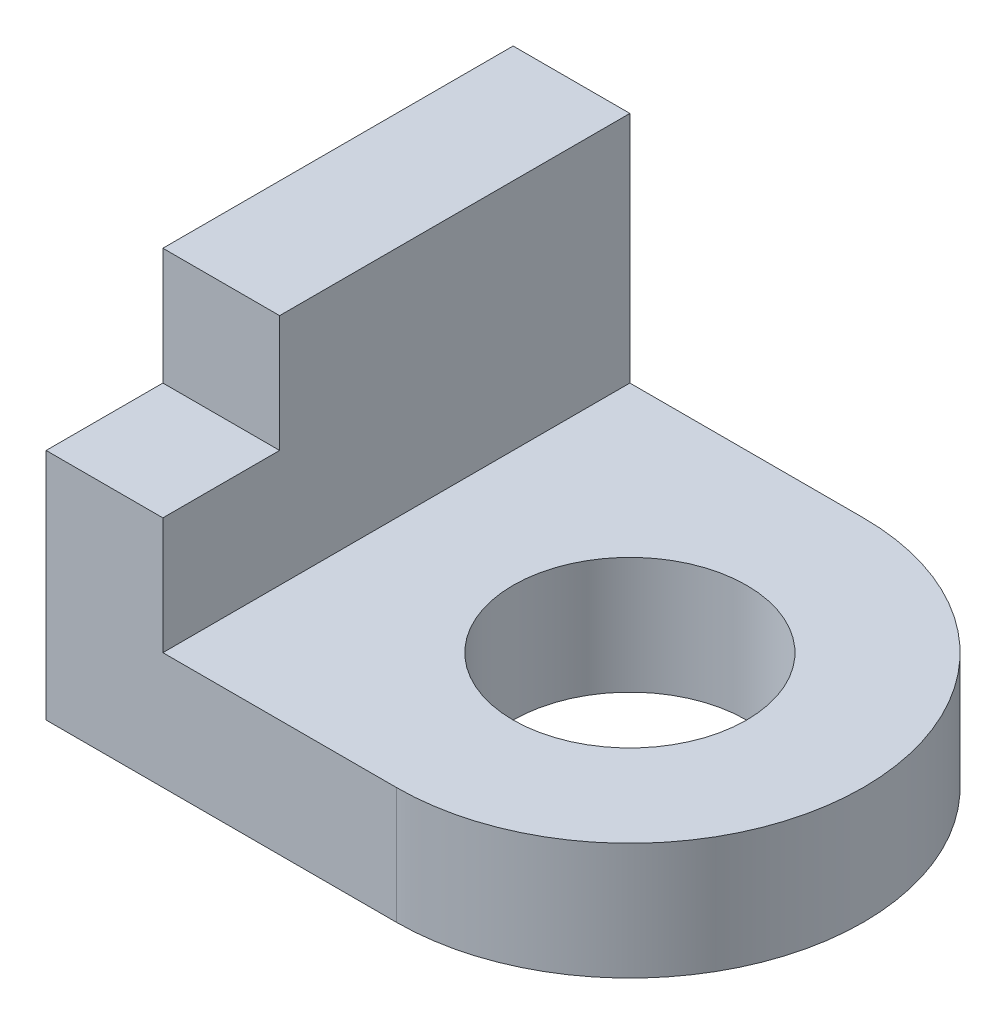
ISO-10303-21;
HEADER;
FILE_DESCRIPTION(('STEP AP214'),'2;1');
FILE_NAME('part.step','',(''),(''),'','','');
FILE_SCHEMA(('AUTOMOTIVE_DESIGN { 1 0 10303 214 1 1 1 1 }'));
ENDSEC;
DATA;
#1=APPLICATION_CONTEXT('core data for automotive mechanical design processes');
#2=APPLICATION_PROTOCOL_DEFINITION('international standard','automotive_design',2000,#1);
#3=PRODUCT_CONTEXT('',#1,'mechanical');
#4=PRODUCT('Part','Part','',(#3));
#5=PRODUCT_RELATED_PRODUCT_CATEGORY('part','',(#4));
#6=PRODUCT_DEFINITION_FORMATION('','',#4);
#7=PRODUCT_DEFINITION_CONTEXT('part definition',#1,'design');
#8=PRODUCT_DEFINITION('design','',#6,#7);
#9=PRODUCT_DEFINITION_SHAPE('','',#8);
#10=(LENGTH_UNIT() NAMED_UNIT(*) SI_UNIT(.MILLI.,.METRE.));
#11=(NAMED_UNIT(*) PLANE_ANGLE_UNIT() SI_UNIT($,.RADIAN.));
#12=(NAMED_UNIT(*) SI_UNIT($,.STERADIAN.) SOLID_ANGLE_UNIT());
#13=UNCERTAINTY_MEASURE_WITH_UNIT(LENGTH_MEASURE(1.E-05),#10,'distance_accuracy_value','');
#14=(GEOMETRIC_REPRESENTATION_CONTEXT(3) GLOBAL_UNCERTAINTY_ASSIGNED_CONTEXT((#13)) GLOBAL_UNIT_ASSIGNED_CONTEXT((#10,
#11,#12)) REPRESENTATION_CONTEXT('',''));
#15=CARTESIAN_POINT('',(0.,0.,0.));
#16=DIRECTION('',(0.,0.,1.));
#17=DIRECTION('',(1.,0.,0.));
#18=AXIS2_PLACEMENT_3D('',#15,#16,#17);
#19=CARTESIAN_POINT('',(0.,10.,0.));
#20=DIRECTION('',(0.,1.,0.));
#21=DIRECTION('',(0.,0.,1.));
#22=AXIS2_PLACEMENT_3D('',#19,#20,#21);
#23=PLANE('',#22);
#24=DIRECTION('',(0.,0.,-1.));
#25=VECTOR('',#24,1.);
#26=CARTESIAN_POINT('',(-20.,10.,20.));
#27=LINE('',#26,#25);
#28=CARTESIAN_POINT('',(-20.,10.,20.));
#29=VERTEX_POINT('',#28);
#30=CARTESIAN_POINT('',(-20.,10.,-20.));
#31=VERTEX_POINT('',#30);
#32=EDGE_CURVE('E51',#29,#31,#27,.T.);
#33=ORIENTED_EDGE('',*,*,#32,.F.);
#34=DIRECTION('',(1.,0.,0.));
#35=VECTOR('',#34,1.);
#36=CARTESIAN_POINT('',(-30.,10.,20.));
#37=LINE('',#36,#35);
#38=CARTESIAN_POINT('',(0.,10.,20.));
#39=VERTEX_POINT('',#38);
#40=EDGE_CURVE('E56',#29,#39,#37,.T.);
#41=ORIENTED_EDGE('',*,*,#40,.T.);
#42=CARTESIAN_POINT('',(0.,10.,0.));
#43=DIRECTION('',(0.,1.,0.));
#44=DIRECTION('',(0.,0.,1.));
#45=AXIS2_PLACEMENT_3D('',#42,#43,#44);
#46=CIRCLE('',#45,20.);
#47=CARTESIAN_POINT('',(0.,10.,-20.));
#48=VERTEX_POINT('',#47);
#49=EDGE_CURVE('E87',#39,#48,#46,.T.);
#50=ORIENTED_EDGE('',*,*,#49,.T.);
#51=DIRECTION('',(-1.,0.,0.));
#52=VECTOR('',#51,1.);
#53=CARTESIAN_POINT('',(0.,10.,-20.));
#54=LINE('',#53,#52);
#55=EDGE_CURVE('E144',#48,#31,#54,.T.);
#56=ORIENTED_EDGE('',*,*,#55,.T.);
#57=EDGE_LOOP('',(#33,#41,#50,#56));
#58=FACE_BOUND('',#57,.T.);
#59=CARTESIAN_POINT('',(0.,10.,0.));
#60=DIRECTION('',(0.,1.,0.));
#61=DIRECTION('',(0.,0.,1.));
#62=AXIS2_PLACEMENT_3D('',#59,#60,#61);
#63=CIRCLE('',#62,10.);
#64=CARTESIAN_POINT('',(0.,10.,10.));
#65=VERTEX_POINT('',#64);
#66=EDGE_CURVE('E98',#65,#65,#63,.T.);
#67=ORIENTED_EDGE('',*,*,#66,.F.);
#68=EDGE_LOOP('',(#67));
#69=FACE_BOUND('',#68,.T.);
#70=ADVANCED_FACE('F36',(#58,#69),#23,.T.);
#71=CARTESIAN_POINT('',(0.,0.,0.));
#72=DIRECTION('',(0.,1.,0.));
#73=DIRECTION('',(0.,0.,1.));
#74=AXIS2_PLACEMENT_3D('',#71,#72,#73);
#75=PLANE('',#74);
#76=CARTESIAN_POINT('',(0.,0.,0.));
#77=DIRECTION('',(0.,1.,0.));
#78=DIRECTION('',(0.,0.,1.));
#79=AXIS2_PLACEMENT_3D('',#76,#77,#78);
#80=CIRCLE('',#79,20.);
#81=CARTESIAN_POINT('',(0.,0.,20.));
#82=VERTEX_POINT('',#81);
#83=CARTESIAN_POINT('',(0.,0.,-20.));
#84=VERTEX_POINT('',#83);
#85=EDGE_CURVE('E93',#82,#84,#80,.T.);
#86=ORIENTED_EDGE('',*,*,#85,.F.);
#87=DIRECTION('',(1.,0.,0.));
#88=VECTOR('',#87,1.);
#89=CARTESIAN_POINT('',(-30.,0.,20.));
#90=LINE('',#89,#88);
#91=CARTESIAN_POINT('',(-30.,0.,20.));
#92=VERTEX_POINT('',#91);
#93=EDGE_CURVE('E76',#92,#82,#90,.T.);
#94=ORIENTED_EDGE('',*,*,#93,.F.);
#95=DIRECTION('',(0.,0.,1.));
#96=VECTOR('',#95,1.);
#97=CARTESIAN_POINT('',(-30.,0.,-20.));
#98=LINE('',#97,#96);
#99=CARTESIAN_POINT('',(-30.,0.,-20.));
#100=VERTEX_POINT('',#99);
#101=EDGE_CURVE('E88',#100,#92,#98,.T.);
#102=ORIENTED_EDGE('',*,*,#101,.F.);
#103=DIRECTION('',(-1.,0.,0.));
#104=VECTOR('',#103,1.);
#105=CARTESIAN_POINT('',(0.,0.,-20.));
#106=LINE('',#105,#104);
#107=EDGE_CURVE('E97',#84,#100,#106,.T.);
#108=ORIENTED_EDGE('',*,*,#107,.F.);
#109=EDGE_LOOP('',(#86,#94,#102,#108));
#110=FACE_BOUND('',#109,.T.);
#111=CARTESIAN_POINT('',(0.,0.,0.));
#112=DIRECTION('',(0.,1.,0.));
#113=DIRECTION('',(0.,0.,1.));
#114=AXIS2_PLACEMENT_3D('',#111,#112,#113);
#115=CIRCLE('',#114,10.);
#116=CARTESIAN_POINT('',(0.,0.,10.));
#117=VERTEX_POINT('',#116);
#118=EDGE_CURVE('E102',#117,#117,#115,.T.);
#119=ORIENTED_EDGE('',*,*,#118,.T.);
#120=EDGE_LOOP('',(#119));
#121=FACE_BOUND('',#120,.T.);
#122=ADVANCED_FACE('F95',(#110,#121),#75,.F.);
#123=CARTESIAN_POINT('',(0.,10.,0.));
#124=DIRECTION('',(0.,-1.,0.));
#125=DIRECTION('',(0.,0.,-1.));
#126=AXIS2_PLACEMENT_3D('',#123,#124,#125);
#127=CYLINDRICAL_SURFACE('',#126,20.);
#128=ORIENTED_EDGE('',*,*,#85,.T.);
#129=DIRECTION('',(0.,-1.,0.));
#130=VECTOR('',#129,1.);
#131=CARTESIAN_POINT('',(0.,10.,-20.));
#132=LINE('',#131,#130);
#133=EDGE_CURVE('E11',#48,#84,#132,.T.);
#134=ORIENTED_EDGE('',*,*,#133,.F.);
#135=ORIENTED_EDGE('',*,*,#49,.F.);
#136=DIRECTION('',(0.,-1.,0.));
#137=VECTOR('',#136,1.);
#138=CARTESIAN_POINT('',(0.,10.,20.));
#139=LINE('',#138,#137);
#140=EDGE_CURVE('E79',#39,#82,#139,.T.);
#141=ORIENTED_EDGE('',*,*,#140,.T.);
#142=EDGE_LOOP('',(#128,#134,#135,#141));
#143=FACE_BOUND('',#142,.T.);
#144=ADVANCED_FACE('F38',(#143),#127,.T.);
#145=CARTESIAN_POINT('',(0.,10.,-20.));
#146=DIRECTION('',(0.,0.,1.));
#147=DIRECTION('',(1.,0.,0.));
#148=AXIS2_PLACEMENT_3D('',#145,#146,#147);
#149=PLANE('',#148);
#150=ORIENTED_EDGE('',*,*,#107,.T.);
#151=DIRECTION('',(0.,-1.,0.));
#152=VECTOR('',#151,1.);
#153=CARTESIAN_POINT('',(-30.,10.,-20.));
#154=LINE('',#153,#152);
#155=CARTESIAN_POINT('',(-30.,30.,-20.));
#156=VERTEX_POINT('',#155);
#157=EDGE_CURVE('E44',#156,#100,#154,.T.);
#158=ORIENTED_EDGE('',*,*,#157,.F.);
#159=DIRECTION('',(-1.,0.,0.));
#160=VECTOR('',#159,1.);
#161=CARTESIAN_POINT('',(-20.,30.,-20.));
#162=LINE('',#161,#160);
#163=CARTESIAN_POINT('',(-20.,30.,-20.));
#164=VERTEX_POINT('',#163);
#165=EDGE_CURVE('E123',#164,#156,#162,.T.);
#166=ORIENTED_EDGE('',*,*,#165,.F.);
#167=DIRECTION('',(0.,1.,0.));
#168=VECTOR('',#167,1.);
#169=CARTESIAN_POINT('',(-20.,10.,-20.));
#170=LINE('',#169,#168);
#171=EDGE_CURVE('E154',#31,#164,#170,.T.);
#172=ORIENTED_EDGE('',*,*,#171,.F.);
#173=ORIENTED_EDGE('',*,*,#55,.F.);
#174=ORIENTED_EDGE('',*,*,#133,.T.);
#175=EDGE_LOOP('',(#150,#158,#166,#172,#173,#174));
#176=FACE_BOUND('',#175,.T.);
#177=ADVANCED_FACE('F120',(#176),#149,.F.);
#178=CARTESIAN_POINT('',(-30.,10.,-20.));
#179=DIRECTION('',(1.,0.,0.));
#180=DIRECTION('',(0.,0.,-1.));
#181=AXIS2_PLACEMENT_3D('',#178,#179,#180);
#182=PLANE('',#181);
#183=ORIENTED_EDGE('',*,*,#101,.T.);
#184=DIRECTION('',(0.,-1.,0.));
#185=VECTOR('',#184,1.);
#186=CARTESIAN_POINT('',(-30.,10.,20.));
#187=LINE('',#186,#185);
#188=CARTESIAN_POINT('',(-30.,20.,20.));
#189=VERTEX_POINT('',#188);
#190=EDGE_CURVE('E83',#189,#92,#187,.T.);
#191=ORIENTED_EDGE('',*,*,#190,.F.);
#192=DIRECTION('',(0.,0.,1.));
#193=VECTOR('',#192,1.);
#194=CARTESIAN_POINT('',(-30.,20.,10.));
#195=LINE('',#194,#193);
#196=CARTESIAN_POINT('',(-30.,20.,10.));
#197=VERTEX_POINT('',#196);
#198=EDGE_CURVE('E165',#197,#189,#195,.T.);
#199=ORIENTED_EDGE('',*,*,#198,.F.);
#200=DIRECTION('',(0.,-1.,0.));
#201=VECTOR('',#200,1.);
#202=CARTESIAN_POINT('',(-30.,30.,9.99999999999999));
#203=LINE('',#202,#201);
#204=CARTESIAN_POINT('',(-30.,30.,9.99999999999999));
#205=VERTEX_POINT('',#204);
#206=EDGE_CURVE('E169',#205,#197,#203,.T.);
#207=ORIENTED_EDGE('',*,*,#206,.F.);
#208=DIRECTION('',(0.,0.,1.));
#209=VECTOR('',#208,1.);
#210=CARTESIAN_POINT('',(-30.,30.,-20.));
#211=LINE('',#210,#209);
#212=EDGE_CURVE('E116',#156,#205,#211,.T.);
#213=ORIENTED_EDGE('',*,*,#212,.F.);
#214=ORIENTED_EDGE('',*,*,#157,.T.);
#215=EDGE_LOOP('',(#183,#191,#199,#207,#213,#214));
#216=FACE_BOUND('',#215,.T.);
#217=ADVANCED_FACE('F112',(#216),#182,.F.);
#218=CARTESIAN_POINT('',(-30.,10.,20.));
#219=DIRECTION('',(0.,0.,-1.));
#220=DIRECTION('',(-1.,0.,0.));
#221=AXIS2_PLACEMENT_3D('',#218,#219,#220);
#222=PLANE('',#221);
#223=ORIENTED_EDGE('',*,*,#93,.T.);
#224=ORIENTED_EDGE('',*,*,#140,.F.);
#225=ORIENTED_EDGE('',*,*,#40,.F.);
#226=DIRECTION('',(0.,-1.,0.));
#227=VECTOR('',#226,1.);
#228=CARTESIAN_POINT('',(-20.,20.,20.));
#229=LINE('',#228,#227);
#230=CARTESIAN_POINT('',(-20.,20.,20.));
#231=VERTEX_POINT('',#230);
#232=EDGE_CURVE('E156',#231,#29,#229,.T.);
#233=ORIENTED_EDGE('',*,*,#232,.F.);
#234=DIRECTION('',(-1.,0.,0.));
#235=VECTOR('',#234,1.);
#236=CARTESIAN_POINT('',(-20.,20.,20.));
#237=LINE('',#236,#235);
#238=EDGE_CURVE('E134',#231,#189,#237,.T.);
#239=ORIENTED_EDGE('',*,*,#238,.T.);
#240=ORIENTED_EDGE('',*,*,#190,.T.);
#241=EDGE_LOOP('',(#223,#224,#225,#233,#239,#240));
#242=FACE_BOUND('',#241,.T.);
#243=ADVANCED_FACE('F78',(#242),#222,.F.);
#244=CARTESIAN_POINT('',(0.,10.,0.));
#245=DIRECTION('',(0.,-1.,0.));
#246=DIRECTION('',(0.,0.,-1.));
#247=AXIS2_PLACEMENT_3D('',#244,#245,#246);
#248=CYLINDRICAL_SURFACE('',#247,10.);
#249=ORIENTED_EDGE('',*,*,#66,.T.);
#250=EDGE_LOOP('',(#249));
#251=FACE_BOUND('',#250,.T.);
#252=ORIENTED_EDGE('',*,*,#118,.F.);
#253=EDGE_LOOP('',(#252));
#254=FACE_BOUND('',#253,.T.);
#255=ADVANCED_FACE('F205',(#251,#254),#248,.F.);
#256=CARTESIAN_POINT('',(-20.,20.,10.));
#257=DIRECTION('',(0.,-1.,0.));
#258=DIRECTION('',(0.,0.,-1.));
#259=AXIS2_PLACEMENT_3D('',#256,#257,#258);
#260=PLANE('',#259);
#261=ORIENTED_EDGE('',*,*,#198,.T.);
#262=ORIENTED_EDGE('',*,*,#238,.F.);
#263=DIRECTION('',(0.,0.,1.));
#264=VECTOR('',#263,1.);
#265=CARTESIAN_POINT('',(-20.,20.,10.));
#266=LINE('',#265,#264);
#267=CARTESIAN_POINT('',(-20.,20.,10.));
#268=VERTEX_POINT('',#267);
#269=EDGE_CURVE('E171',#268,#231,#266,.T.);
#270=ORIENTED_EDGE('',*,*,#269,.F.);
#271=DIRECTION('',(-1.,0.,0.));
#272=VECTOR('',#271,1.);
#273=CARTESIAN_POINT('',(-20.,20.,10.));
#274=LINE('',#273,#272);
#275=EDGE_CURVE('E138',#268,#197,#274,.T.);
#276=ORIENTED_EDGE('',*,*,#275,.T.);
#277=EDGE_LOOP('',(#261,#262,#270,#276));
#278=FACE_BOUND('',#277,.T.);
#279=ADVANCED_FACE('F178',(#278),#260,.F.);
#280=CARTESIAN_POINT('',(-20.,30.,-20.));
#281=DIRECTION('',(0.,-1.,0.));
#282=DIRECTION('',(0.,0.,-1.));
#283=AXIS2_PLACEMENT_3D('',#280,#281,#282);
#284=PLANE('',#283);
#285=ORIENTED_EDGE('',*,*,#212,.T.);
#286=DIRECTION('',(-1.,0.,0.));
#287=VECTOR('',#286,1.);
#288=CARTESIAN_POINT('',(-20.,30.,9.99999999999999));
#289=LINE('',#288,#287);
#290=CARTESIAN_POINT('',(-20.,30.,9.99999999999999));
#291=VERTEX_POINT('',#290);
#292=EDGE_CURVE('E135',#291,#205,#289,.T.);
#293=ORIENTED_EDGE('',*,*,#292,.F.);
#294=DIRECTION('',(0.,0.,1.));
#295=VECTOR('',#294,1.);
#296=CARTESIAN_POINT('',(-20.,30.,-20.));
#297=LINE('',#296,#295);
#298=EDGE_CURVE('E133',#164,#291,#297,.T.);
#299=ORIENTED_EDGE('',*,*,#298,.F.);
#300=ORIENTED_EDGE('',*,*,#165,.T.);
#301=EDGE_LOOP('',(#285,#293,#299,#300));
#302=FACE_BOUND('',#301,.T.);
#303=ADVANCED_FACE('F129',(#302),#284,.F.);
#304=CARTESIAN_POINT('',(-20.,30.,9.99999999999999));
#305=DIRECTION('',(0.,0.,-1.));
#306=DIRECTION('',(0.,1.,0.));
#307=AXIS2_PLACEMENT_3D('',#304,#305,#306);
#308=PLANE('',#307);
#309=ORIENTED_EDGE('',*,*,#206,.T.);
#310=ORIENTED_EDGE('',*,*,#275,.F.);
#311=DIRECTION('',(0.,-1.,0.));
#312=VECTOR('',#311,1.);
#313=CARTESIAN_POINT('',(-20.,30.,9.99999999999999));
#314=LINE('',#313,#312);
#315=EDGE_CURVE('E159',#291,#268,#314,.T.);
#316=ORIENTED_EDGE('',*,*,#315,.F.);
#317=ORIENTED_EDGE('',*,*,#292,.T.);
#318=EDGE_LOOP('',(#309,#310,#316,#317));
#319=FACE_BOUND('',#318,.T.);
#320=ADVANCED_FACE('F189',(#319),#308,.F.);
#321=CARTESIAN_POINT('',(-20.,0.,0.));
#322=DIRECTION('',(1.,0.,0.));
#323=DIRECTION('',(0.,0.,-1.));
#324=AXIS2_PLACEMENT_3D('',#321,#322,#323);
#325=PLANE('',#324);
#326=ORIENTED_EDGE('',*,*,#269,.T.);
#327=ORIENTED_EDGE('',*,*,#232,.T.);
#328=ORIENTED_EDGE('',*,*,#32,.T.);
#329=ORIENTED_EDGE('',*,*,#171,.T.);
#330=ORIENTED_EDGE('',*,*,#298,.T.);
#331=ORIENTED_EDGE('',*,*,#315,.T.);
#332=EDGE_LOOP('',(#326,#327,#328,#329,#330,#331));
#333=FACE_BOUND('',#332,.T.);
#334=ADVANCED_FACE('F153',(#333),#325,.T.);
#335=CLOSED_SHELL('',(#70,#122,#144,#177,#217,#243,#255,#279,#303,#320,#334));
#336=MANIFOLD_SOLID_BREP('B2',#335);
#337=ADVANCED_BREP_SHAPE_REPRESENTATION('',(#18,#336),#14);
#338=SHAPE_DEFINITION_REPRESENTATION(#9,#337);
ENDSEC;
END-ISO-10303-21;
